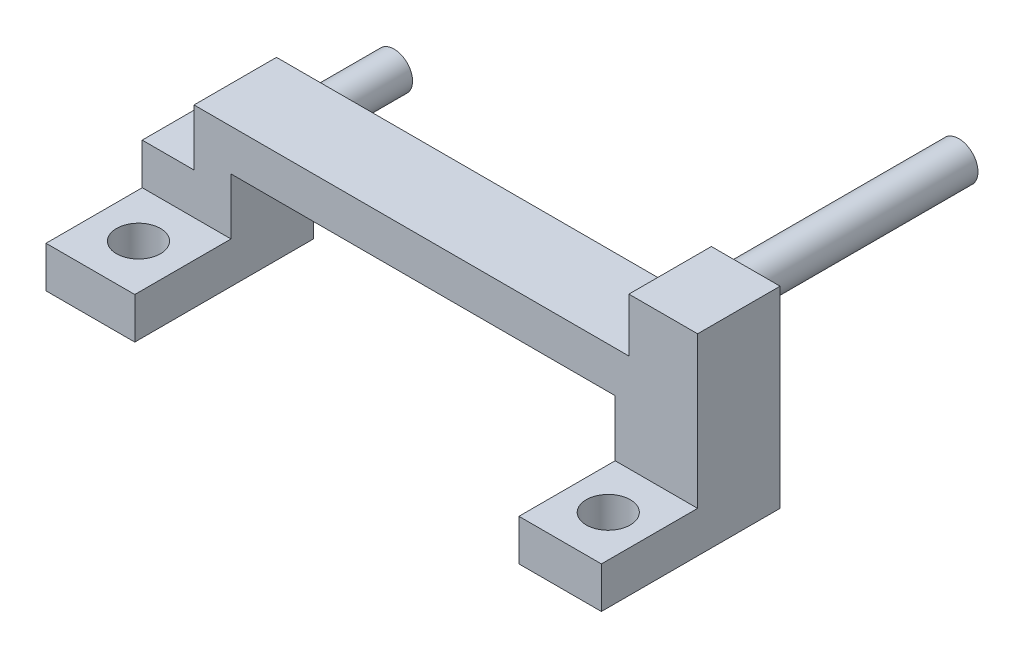
ISO-10303-21;
HEADER;
FILE_DESCRIPTION(('STEP AP214'),'2;1');
FILE_NAME('part.step','',(''),(''),'','','');
FILE_SCHEMA(('AUTOMOTIVE_DESIGN { 1 0 10303 214 1 1 1 1 }'));
ENDSEC;
DATA;
#1=APPLICATION_CONTEXT('core data for automotive mechanical design processes');
#2=APPLICATION_PROTOCOL_DEFINITION('international standard','automotive_design',2000,#1);
#3=PRODUCT_CONTEXT('',#1,'mechanical');
#4=PRODUCT('Part','Part','',(#3));
#5=PRODUCT_RELATED_PRODUCT_CATEGORY('part','',(#4));
#6=PRODUCT_DEFINITION_FORMATION('','',#4);
#7=PRODUCT_DEFINITION_CONTEXT('part definition',#1,'design');
#8=PRODUCT_DEFINITION('design','',#6,#7);
#9=PRODUCT_DEFINITION_SHAPE('','',#8);
#10=(LENGTH_UNIT() NAMED_UNIT(*) SI_UNIT(.MILLI.,.METRE.));
#11=(NAMED_UNIT(*) PLANE_ANGLE_UNIT() SI_UNIT($,.RADIAN.));
#12=(NAMED_UNIT(*) SI_UNIT($,.STERADIAN.) SOLID_ANGLE_UNIT());
#13=UNCERTAINTY_MEASURE_WITH_UNIT(LENGTH_MEASURE(1.E-05),#10,'distance_accuracy_value','');
#14=(GEOMETRIC_REPRESENTATION_CONTEXT(3) GLOBAL_UNCERTAINTY_ASSIGNED_CONTEXT((#13)) GLOBAL_UNIT_ASSIGNED_CONTEXT((#10,
#11,#12)) REPRESENTATION_CONTEXT('',''));
#15=CARTESIAN_POINT('',(0.,0.,0.));
#16=DIRECTION('',(0.,0.,1.));
#17=DIRECTION('',(1.,0.,0.));
#18=AXIS2_PLACEMENT_3D('',#15,#16,#17);
#19=CARTESIAN_POINT('',(0.,0.,6.));
#20=DIRECTION('',(0.,0.,-1.));
#21=DIRECTION('',(-1.,0.,0.));
#22=AXIS2_PLACEMENT_3D('',#19,#20,#21);
#23=PLANE('',#22);
#24=DIRECTION('',(0.,1.,0.));
#25=VECTOR('',#24,1.);
#26=CARTESIAN_POINT('',(-4.43414634146342,-3.49756097560976,6.));
#27=LINE('',#26,#25);
#28=CARTESIAN_POINT('',(-4.43414634146342,-7.59756097560976,6.));
#29=VERTEX_POINT('',#28);
#30=CARTESIAN_POINT('',(-4.43414634146342,-3.49756097560976,6.));
#31=VERTEX_POINT('',#30);
#32=EDGE_CURVE('E217',#29,#31,#27,.T.);
#33=ORIENTED_EDGE('',*,*,#32,.F.);
#34=DIRECTION('',(-1.,0.,0.));
#35=VECTOR('',#34,1.);
#36=CARTESIAN_POINT('',(-3.43414634146343,-7.59756097560976,6.));
#37=LINE('',#36,#35);
#38=CARTESIAN_POINT('',(1.56585365853658,-7.59756097560976,6.));
#39=VERTEX_POINT('',#38);
#40=EDGE_CURVE('E281',#39,#29,#37,.T.);
#41=ORIENTED_EDGE('',*,*,#40,.F.);
#42=DIRECTION('',(0.,-1.,0.));
#43=VECTOR('',#42,1.);
#44=CARTESIAN_POINT('',(1.56585365853658,-10.5975609756098,6.));
#45=LINE('',#44,#43);
#46=CARTESIAN_POINT('',(1.56585365853657,3.40243902439024,6.));
#47=VERTEX_POINT('',#46);
#48=EDGE_CURVE('E192',#47,#39,#45,.T.);
#49=ORIENTED_EDGE('',*,*,#48,.F.);
#50=DIRECTION('',(-1.,0.,0.));
#51=VECTOR('',#50,1.);
#52=CARTESIAN_POINT('',(-3.43414634146343,3.40243902439024,6.));
#53=LINE('',#52,#51);
#54=CARTESIAN_POINT('',(-3.43414634146343,3.40243902439024,6.));
#55=VERTEX_POINT('',#54);
#56=EDGE_CURVE('E294',#47,#55,#53,.T.);
#57=ORIENTED_EDGE('',*,*,#56,.T.);
#58=DIRECTION('',(0.,-1.,0.));
#59=VECTOR('',#58,1.);
#60=CARTESIAN_POINT('',(-3.43414634146343,-1.49756097560976,6.));
#61=LINE('',#60,#59);
#62=CARTESIAN_POINT('',(-3.43414634146343,-0.497560975609757,6.));
#63=VERTEX_POINT('',#62);
#64=EDGE_CURVE('E298',#55,#63,#61,.T.);
#65=ORIENTED_EDGE('',*,*,#64,.T.);
#66=DIRECTION('',(1.,0.,0.));
#67=VECTOR('',#66,1.);
#68=CARTESIAN_POINT('',(-35.0731395246062,-0.497560975609762,6.));
#69=LINE('',#68,#67);
#70=CARTESIAN_POINT('',(-35.0731395246062,-0.497560975609762,6.));
#71=VERTEX_POINT('',#70);
#72=EDGE_CURVE('E204',#71,#63,#69,.T.);
#73=ORIENTED_EDGE('',*,*,#72,.F.);
#74=DIRECTION('',(0.,-1.,0.));
#75=VECTOR('',#74,1.);
#76=CARTESIAN_POINT('',(-35.0731395246062,-4.59756097560976,6.));
#77=LINE('',#76,#75);
#78=CARTESIAN_POINT('',(-35.0731395246062,-4.59756097560976,6.));
#79=VERTEX_POINT('',#78);
#80=EDGE_CURVE('E302',#71,#79,#77,.T.);
#81=ORIENTED_EDGE('',*,*,#80,.T.);
#82=DIRECTION('',(-1.,0.,0.));
#83=VECTOR('',#82,1.);
#84=CARTESIAN_POINT('',(-38.8431395246063,-4.59756097560976,6.));
#85=LINE('',#84,#83);
#86=CARTESIAN_POINT('',(-38.8431395246063,-4.59756097560976,6.));
#87=VERTEX_POINT('',#86);
#88=EDGE_CURVE('E306',#79,#87,#85,.T.);
#89=ORIENTED_EDGE('',*,*,#88,.T.);
#90=DIRECTION('',(0.,-1.,0.));
#91=VECTOR('',#90,1.);
#92=CARTESIAN_POINT('',(-38.8431395246063,-10.5975609756098,6.));
#93=LINE('',#92,#91);
#94=CARTESIAN_POINT('',(-38.8431395246063,-7.59756097560976,6.));
#95=VERTEX_POINT('',#94);
#96=EDGE_CURVE('E68',#87,#95,#93,.T.);
#97=ORIENTED_EDGE('',*,*,#96,.T.);
#98=DIRECTION('',(-1.,0.,0.));
#99=VECTOR('',#98,1.);
#100=CARTESIAN_POINT('',(-32.3841463414634,-7.59756097560976,6.));
#101=LINE('',#100,#99);
#102=CARTESIAN_POINT('',(-32.3841463414634,-7.59756097560976,6.));
#103=VERTEX_POINT('',#102);
#104=EDGE_CURVE('E63',#103,#95,#101,.T.);
#105=ORIENTED_EDGE('',*,*,#104,.F.);
#106=DIRECTION('',(0.,1.,0.));
#107=VECTOR('',#106,1.);
#108=CARTESIAN_POINT('',(-32.3841463414634,-3.49756097560976,6.));
#109=LINE('',#108,#107);
#110=CARTESIAN_POINT('',(-32.3841463414634,-3.49756097560976,6.));
#111=VERTEX_POINT('',#110);
#112=EDGE_CURVE('E287',#103,#111,#109,.T.);
#113=ORIENTED_EDGE('',*,*,#112,.T.);
#114=DIRECTION('',(1.,0.,0.));
#115=VECTOR('',#114,1.);
#116=CARTESIAN_POINT('',(-3.43414634146343,-3.49756097560976,6.));
#117=LINE('',#116,#115);
#118=EDGE_CURVE('E290',#111,#31,#117,.T.);
#119=ORIENTED_EDGE('',*,*,#118,.T.);
#120=EDGE_LOOP('',(#33,#41,#49,#57,#65,#73,#81,#89,#97,#105,#113,#119));
#121=FACE_BOUND('',#120,.T.);
#122=ADVANCED_FACE('F47',(#121),#23,.F.);
#123=CARTESIAN_POINT('',(-34.3841463414634,-3.49756097560976,0.));
#124=DIRECTION('',(0.,1.,0.));
#125=DIRECTION('',(-1.,0.,0.));
#126=AXIS2_PLACEMENT_3D('',#123,#124,#125);
#127=PLANE('',#126);
#128=DIRECTION('',(1.,0.,0.));
#129=VECTOR('',#128,1.);
#130=CARTESIAN_POINT('',(-34.3841463414634,-3.49756097560976,0.));
#131=LINE('',#130,#129);
#132=CARTESIAN_POINT('',(-32.3841463414634,-3.49756097560976,0.));
#133=VERTEX_POINT('',#132);
#134=CARTESIAN_POINT('',(-4.43414634146342,-3.49756097560976,0.));
#135=VERTEX_POINT('',#134);
#136=EDGE_CURVE('E336',#133,#135,#131,.T.);
#137=ORIENTED_EDGE('',*,*,#136,.T.);
#138=DIRECTION('',(0.,0.,-1.));
#139=VECTOR('',#138,1.);
#140=CARTESIAN_POINT('',(-4.43414634146342,-3.49756097560976,0.));
#141=LINE('',#140,#139);
#142=EDGE_CURVE('E220',#31,#135,#141,.T.);
#143=ORIENTED_EDGE('',*,*,#142,.F.);
#144=ORIENTED_EDGE('',*,*,#118,.F.);
#145=DIRECTION('',(0.,0.,1.));
#146=VECTOR('',#145,1.);
#147=CARTESIAN_POINT('',(-32.3841463414634,-3.49756097560976,3.));
#148=LINE('',#147,#146);
#149=EDGE_CURVE('E354',#133,#111,#148,.T.);
#150=ORIENTED_EDGE('',*,*,#149,.F.);
#151=EDGE_LOOP('',(#137,#143,#144,#150));
#152=FACE_BOUND('',#151,.T.);
#153=ADVANCED_FACE('F49',(#152),#127,.F.);
#154=CARTESIAN_POINT('',(0.,0.,0.));
#155=DIRECTION('',(0.,0.,1.));
#156=DIRECTION('',(1.,0.,0.));
#157=AXIS2_PLACEMENT_3D('',#154,#155,#156);
#158=PLANE('',#157);
#159=CARTESIAN_POINT('',(-36.5231395246063,-7.04756097560976,0.));
#160=DIRECTION('',(0.,0.,1.));
#161=DIRECTION('',(1.,0.,0.));
#162=AXIS2_PLACEMENT_3D('',#159,#160,#161);
#163=CIRCLE('',#162,1.35);
#164=CARTESIAN_POINT('',(-35.1731395246063,-7.04756097560976,0.));
#165=VERTEX_POINT('',#164);
#166=EDGE_CURVE('E11',#165,#165,#163,.F.);
#167=ORIENTED_EDGE('',*,*,#166,.F.);
#168=EDGE_LOOP('',(#167));
#169=FACE_BOUND('',#168,.T.);
#170=CARTESIAN_POINT('',(-1.43414634146342,1.80243902439024,0.));
#171=DIRECTION('',(0.,0.,1.));
#172=DIRECTION('',(1.,0.,0.));
#173=AXIS2_PLACEMENT_3D('',#170,#171,#172);
#174=CIRCLE('',#173,1.4);
#175=CARTESIAN_POINT('',(-0.034146341463424,1.80243902439024,0.));
#176=VERTEX_POINT('',#175);
#177=EDGE_CURVE('E337',#176,#176,#174,.F.);
#178=ORIENTED_EDGE('',*,*,#177,.F.);
#179=EDGE_LOOP('',(#178));
#180=FACE_BOUND('',#179,.T.);
#181=DIRECTION('',(1.,0.,0.));
#182=VECTOR('',#181,1.);
#183=CARTESIAN_POINT('',(-35.3841463414634,-10.5975609756098,0.));
#184=LINE('',#183,#182);
#185=CARTESIAN_POINT('',(-38.8431395246063,-10.5975609756098,0.));
#186=VERTEX_POINT('',#185);
#187=CARTESIAN_POINT('',(-32.3841463414634,-10.5975609756098,0.));
#188=VERTEX_POINT('',#187);
#189=EDGE_CURVE('E361',#186,#188,#184,.T.);
#190=ORIENTED_EDGE('',*,*,#189,.F.);
#191=DIRECTION('',(0.,-1.,0.));
#192=VECTOR('',#191,1.);
#193=CARTESIAN_POINT('',(-38.8431395246063,-4.59756097560976,0.));
#194=LINE('',#193,#192);
#195=CARTESIAN_POINT('',(-38.8431395246063,-4.59756097560976,0.));
#196=VERTEX_POINT('',#195);
#197=EDGE_CURVE('E316',#196,#186,#194,.T.);
#198=ORIENTED_EDGE('',*,*,#197,.F.);
#199=DIRECTION('',(1.,0.,0.));
#200=VECTOR('',#199,1.);
#201=CARTESIAN_POINT('',(-38.8431395246063,-4.59756097560976,0.));
#202=LINE('',#201,#200);
#203=CARTESIAN_POINT('',(-35.0731395246062,-4.59756097560976,0.));
#204=VERTEX_POINT('',#203);
#205=EDGE_CURVE('E326',#196,#204,#202,.T.);
#206=ORIENTED_EDGE('',*,*,#205,.T.);
#207=DIRECTION('',(0.,-1.,0.));
#208=VECTOR('',#207,1.);
#209=CARTESIAN_POINT('',(-35.0731395246062,-1.49756097560976,0.));
#210=LINE('',#209,#208);
#211=CARTESIAN_POINT('',(-35.0731395246062,-0.497560975609762,0.));
#212=VERTEX_POINT('',#211);
#213=EDGE_CURVE('E333',#212,#204,#210,.T.);
#214=ORIENTED_EDGE('',*,*,#213,.F.);
#215=DIRECTION('',(-1.,0.,0.));
#216=VECTOR('',#215,1.);
#217=CARTESIAN_POINT('',(-35.0731395246062,-0.497560975609762,0.));
#218=LINE('',#217,#216);
#219=CARTESIAN_POINT('',(-3.43414634146343,-0.497560975609757,0.));
#220=VERTEX_POINT('',#219);
#221=EDGE_CURVE('E210',#220,#212,#218,.T.);
#222=ORIENTED_EDGE('',*,*,#221,.F.);
#223=DIRECTION('',(0.,-1.,0.));
#224=VECTOR('',#223,1.);
#225=CARTESIAN_POINT('',(-3.43414634146343,3.40243902439024,0.));
#226=LINE('',#225,#224);
#227=CARTESIAN_POINT('',(-3.43414634146343,3.40243902439024,0.));
#228=VERTEX_POINT('',#227);
#229=EDGE_CURVE('E173',#228,#220,#226,.T.);
#230=ORIENTED_EDGE('',*,*,#229,.F.);
#231=DIRECTION('',(-1.,0.,0.));
#232=VECTOR('',#231,1.);
#233=CARTESIAN_POINT('',(-3.43414634146343,3.40243902439024,0.));
#234=LINE('',#233,#232);
#235=CARTESIAN_POINT('',(1.56585365853657,3.40243902439024,0.));
#236=VERTEX_POINT('',#235);
#237=EDGE_CURVE('E172',#236,#228,#234,.T.);
#238=ORIENTED_EDGE('',*,*,#237,.F.);
#239=DIRECTION('',(0.,1.,0.));
#240=VECTOR('',#239,1.);
#241=CARTESIAN_POINT('',(1.56585365853658,-10.5975609756098,0.));
#242=LINE('',#241,#240);
#243=CARTESIAN_POINT('',(1.56585365853658,-10.5975609756098,0.));
#244=VERTEX_POINT('',#243);
#245=EDGE_CURVE('E180',#244,#236,#242,.T.);
#246=ORIENTED_EDGE('',*,*,#245,.F.);
#247=DIRECTION('',(1.,0.,0.));
#248=VECTOR('',#247,1.);
#249=CARTESIAN_POINT('',(-3.43414634146342,-10.5975609756098,0.));
#250=LINE('',#249,#248);
#251=CARTESIAN_POINT('',(-4.43414634146342,-10.5975609756098,0.));
#252=VERTEX_POINT('',#251);
#253=EDGE_CURVE('E160',#252,#244,#250,.T.);
#254=ORIENTED_EDGE('',*,*,#253,.F.);
#255=DIRECTION('',(0.,-1.,0.));
#256=VECTOR('',#255,1.);
#257=CARTESIAN_POINT('',(-4.43414634146342,-3.49756097560976,0.));
#258=LINE('',#257,#256);
#259=EDGE_CURVE('E214',#135,#252,#258,.T.);
#260=ORIENTED_EDGE('',*,*,#259,.F.);
#261=ORIENTED_EDGE('',*,*,#136,.F.);
#262=DIRECTION('',(0.,1.,0.));
#263=VECTOR('',#262,1.);
#264=CARTESIAN_POINT('',(-32.3841463414634,-10.5975609756098,0.));
#265=LINE('',#264,#263);
#266=EDGE_CURVE('E358',#188,#133,#265,.T.);
#267=ORIENTED_EDGE('',*,*,#266,.F.);
#268=EDGE_LOOP('',(#190,#198,#206,#214,#222,#230,#238,#246,#254,#260,#261,#267));
#269=FACE_BOUND('',#268,.T.);
#270=ADVANCED_FACE('F188',(#169,#180,#269),#158,.F.);
#271=CARTESIAN_POINT('',(-3.43414634146343,3.40243902439024,3.));
#272=DIRECTION('',(1.,0.,0.));
#273=DIRECTION('',(0.,1.,0.));
#274=AXIS2_PLACEMENT_3D('',#271,#272,#273);
#275=PLANE('',#274);
#276=ORIENTED_EDGE('',*,*,#229,.T.);
#277=DIRECTION('',(0.,0.,-1.));
#278=VECTOR('',#277,1.);
#279=CARTESIAN_POINT('',(-3.43414634146343,-0.497560975609757,0.));
#280=LINE('',#279,#278);
#281=EDGE_CURVE('E207',#63,#220,#280,.T.);
#282=ORIENTED_EDGE('',*,*,#281,.F.);
#283=ORIENTED_EDGE('',*,*,#64,.F.);
#284=DIRECTION('',(0.,0.,-1.));
#285=VECTOR('',#284,1.);
#286=CARTESIAN_POINT('',(-3.43414634146343,3.40243902439024,3.));
#287=LINE('',#286,#285);
#288=EDGE_CURVE('E342',#55,#228,#287,.T.);
#289=ORIENTED_EDGE('',*,*,#288,.T.);
#290=EDGE_LOOP('',(#276,#282,#283,#289));
#291=FACE_BOUND('',#290,.T.);
#292=ADVANCED_FACE('F401',(#291),#275,.F.);
#293=CARTESIAN_POINT('',(-3.43414634146342,-10.5975609756098,3.));
#294=DIRECTION('',(0.,1.,0.));
#295=DIRECTION('',(0.,0.,1.));
#296=AXIS2_PLACEMENT_3D('',#293,#294,#295);
#297=PLANE('',#296);
#298=ORIENTED_EDGE('',*,*,#253,.T.);
#299=DIRECTION('',(0.,0.,-1.));
#300=VECTOR('',#299,1.);
#301=CARTESIAN_POINT('',(1.56585365853658,-10.5975609756098,6.));
#302=LINE('',#301,#300);
#303=CARTESIAN_POINT('',(1.56585365853658,-10.5975609756098,13.));
#304=VERTEX_POINT('',#303);
#305=EDGE_CURVE('E164',#304,#244,#302,.T.);
#306=ORIENTED_EDGE('',*,*,#305,.F.);
#307=DIRECTION('',(1.,0.,0.));
#308=VECTOR('',#307,1.);
#309=CARTESIAN_POINT('',(-3.43414634146343,-10.5975609756098,13.));
#310=LINE('',#309,#308);
#311=CARTESIAN_POINT('',(-4.43414634146342,-10.5975609756098,13.));
#312=VERTEX_POINT('',#311);
#313=EDGE_CURVE('E284',#312,#304,#310,.T.);
#314=ORIENTED_EDGE('',*,*,#313,.F.);
#315=DIRECTION('',(0.,0.,1.));
#316=VECTOR('',#315,1.);
#317=CARTESIAN_POINT('',(-4.43414634146342,-10.5975609756098,6.));
#318=LINE('',#317,#316);
#319=EDGE_CURVE('E166',#252,#312,#318,.T.);
#320=ORIENTED_EDGE('',*,*,#319,.F.);
#321=EDGE_LOOP('',(#298,#306,#314,#320));
#322=FACE_BOUND('',#321,.T.);
#323=CARTESIAN_POINT('',(-1.43414634146343,-10.5975609756098,9.5));
#324=DIRECTION('',(0.,1.,0.));
#325=DIRECTION('',(0.,0.,1.));
#326=AXIS2_PLACEMENT_3D('',#323,#324,#325);
#327=CIRCLE('',#326,1.6);
#328=CARTESIAN_POINT('',(-1.43414634146343,-10.5975609756098,11.1));
#329=VERTEX_POINT('',#328);
#330=EDGE_CURVE('E241',#329,#329,#327,.T.);
#331=ORIENTED_EDGE('',*,*,#330,.T.);
#332=EDGE_LOOP('',(#331));
#333=FACE_BOUND('',#332,.T.);
#334=ADVANCED_FACE('F162',(#322,#333),#297,.F.);
#335=CARTESIAN_POINT('',(-3.43414634146343,3.40243902439024,3.));
#336=DIRECTION('',(0.,-1.,0.));
#337=DIRECTION('',(0.,0.,-1.));
#338=AXIS2_PLACEMENT_3D('',#335,#336,#337);
#339=PLANE('',#338);
#340=ORIENTED_EDGE('',*,*,#237,.T.);
#341=ORIENTED_EDGE('',*,*,#288,.F.);
#342=ORIENTED_EDGE('',*,*,#56,.F.);
#343=DIRECTION('',(0.,0.,1.));
#344=VECTOR('',#343,1.);
#345=CARTESIAN_POINT('',(1.56585365853657,3.40243902439024,6.));
#346=LINE('',#345,#344);
#347=EDGE_CURVE('E191',#236,#47,#346,.T.);
#348=ORIENTED_EDGE('',*,*,#347,.F.);
#349=EDGE_LOOP('',(#340,#341,#342,#348));
#350=FACE_BOUND('',#349,.T.);
#351=ADVANCED_FACE('F403',(#350),#339,.F.);
#352=CARTESIAN_POINT('',(-1.43414634146342,1.80243902439024,-16.));
#353=DIRECTION('',(0.,0.,1.));
#354=DIRECTION('',(1.,0.,0.));
#355=AXIS2_PLACEMENT_3D('',#352,#353,#354);
#356=CYLINDRICAL_SURFACE('',#355,1.4);
#357=CARTESIAN_POINT('',(-1.43414634146342,1.80243902439024,-16.));
#358=DIRECTION('',(0.,0.,-1.));
#359=DIRECTION('',(-1.,0.,0.));
#360=AXIS2_PLACEMENT_3D('',#357,#358,#359);
#361=CIRCLE('',#360,1.4);
#362=CARTESIAN_POINT('',(-2.83414634146342,1.80243902439024,-16.));
#363=VERTEX_POINT('',#362);
#364=EDGE_CURVE('E341',#363,#363,#361,.T.);
#365=ORIENTED_EDGE('',*,*,#364,.F.);
#366=EDGE_LOOP('',(#365));
#367=FACE_BOUND('',#366,.T.);
#368=ORIENTED_EDGE('',*,*,#177,.T.);
#369=EDGE_LOOP('',(#368));
#370=FACE_BOUND('',#369,.T.);
#371=ADVANCED_FACE('F462',(#367,#370),#356,.T.);
#372=CARTESIAN_POINT('',(-1.43414634146342,1.80243902439024,-16.));
#373=DIRECTION('',(0.,0.,-1.));
#374=DIRECTION('',(-1.,0.,0.));
#375=AXIS2_PLACEMENT_3D('',#372,#373,#374);
#376=PLANE('',#375);
#377=ORIENTED_EDGE('',*,*,#364,.T.);
#378=EDGE_LOOP('',(#377));
#379=FACE_BOUND('',#378,.T.);
#380=ADVANCED_FACE('F467',(#379),#376,.T.);
#381=CARTESIAN_POINT('',(-32.3841463414634,-10.5975609756098,3.));
#382=DIRECTION('',(-1.,0.,0.));
#383=DIRECTION('',(0.,-1.,0.));
#384=AXIS2_PLACEMENT_3D('',#381,#382,#383);
#385=PLANE('',#384);
#386=ORIENTED_EDGE('',*,*,#149,.T.);
#387=ORIENTED_EDGE('',*,*,#112,.F.);
#388=DIRECTION('',(0.,0.,-1.));
#389=VECTOR('',#388,1.);
#390=CARTESIAN_POINT('',(-32.3841463414634,-7.59756097560976,13.));
#391=LINE('',#390,#389);
#392=CARTESIAN_POINT('',(-32.3841463414634,-7.59756097560976,13.));
#393=VERTEX_POINT('',#392);
#394=EDGE_CURVE('E274',#393,#103,#391,.T.);
#395=ORIENTED_EDGE('',*,*,#394,.F.);
#396=DIRECTION('',(0.,1.,0.));
#397=VECTOR('',#396,1.);
#398=CARTESIAN_POINT('',(-32.3841463414634,-10.5975609756098,13.));
#399=LINE('',#398,#397);
#400=CARTESIAN_POINT('',(-32.3841463414634,-10.5975609756098,13.));
#401=VERTEX_POINT('',#400);
#402=EDGE_CURVE('E253',#401,#393,#399,.T.);
#403=ORIENTED_EDGE('',*,*,#402,.F.);
#404=DIRECTION('',(0.,0.,1.));
#405=VECTOR('',#404,1.);
#406=CARTESIAN_POINT('',(-32.3841463414634,-10.5975609756098,3.));
#407=LINE('',#406,#405);
#408=EDGE_CURVE('E56',#188,#401,#407,.T.);
#409=ORIENTED_EDGE('',*,*,#408,.F.);
#410=ORIENTED_EDGE('',*,*,#266,.T.);
#411=EDGE_LOOP('',(#386,#387,#395,#403,#409,#410));
#412=FACE_BOUND('',#411,.T.);
#413=ADVANCED_FACE('F378',(#412),#385,.F.);
#414=CARTESIAN_POINT('',(0.,-10.5975609756098,0.));
#415=DIRECTION('',(0.,-1.,0.));
#416=DIRECTION('',(0.,0.,-1.));
#417=AXIS2_PLACEMENT_3D('',#414,#415,#416);
#418=PLANE('',#417);
#419=CARTESIAN_POINT('',(-35.6136429330348,-10.5975609756098,9.5));
#420=DIRECTION('',(0.,-1.,0.));
#421=DIRECTION('',(0.,0.,-1.));
#422=AXIS2_PLACEMENT_3D('',#419,#420,#421);
#423=CIRCLE('',#422,1.6);
#424=CARTESIAN_POINT('',(-35.6136429330348,-10.5975609756098,7.9));
#425=VERTEX_POINT('',#424);
#426=EDGE_CURVE('E249',#425,#425,#423,.T.);
#427=ORIENTED_EDGE('',*,*,#426,.F.);
#428=EDGE_LOOP('',(#427));
#429=FACE_BOUND('',#428,.T.);
#430=ORIENTED_EDGE('',*,*,#408,.T.);
#431=DIRECTION('',(1.,0.,0.));
#432=VECTOR('',#431,1.);
#433=CARTESIAN_POINT('',(-32.3841463414634,-10.5975609756098,13.));
#434=LINE('',#433,#432);
#435=CARTESIAN_POINT('',(-38.8431395246063,-10.5975609756098,13.));
#436=VERTEX_POINT('',#435);
#437=EDGE_CURVE('E264',#436,#401,#434,.T.);
#438=ORIENTED_EDGE('',*,*,#437,.F.);
#439=DIRECTION('',(0.,0.,1.));
#440=VECTOR('',#439,1.);
#441=CARTESIAN_POINT('',(-38.8431395246063,-10.5975609756098,0.));
#442=LINE('',#441,#440);
#443=EDGE_CURVE('E320',#186,#436,#442,.T.);
#444=ORIENTED_EDGE('',*,*,#443,.F.);
#445=ORIENTED_EDGE('',*,*,#189,.T.);
#446=EDGE_LOOP('',(#430,#438,#444,#445));
#447=FACE_BOUND('',#446,.T.);
#448=ADVANCED_FACE('F370',(#429,#447),#418,.T.);
#449=CARTESIAN_POINT('',(-35.0731395246062,0.,0.));
#450=DIRECTION('',(-1.,0.,0.));
#451=DIRECTION('',(0.,0.,1.));
#452=AXIS2_PLACEMENT_3D('',#449,#450,#451);
#453=PLANE('',#452);
#454=DIRECTION('',(0.,0.,-1.));
#455=VECTOR('',#454,1.);
#456=CARTESIAN_POINT('',(-35.0731395246062,-4.59756097560976,0.));
#457=LINE('',#456,#455);
#458=EDGE_CURVE('E315',#79,#204,#457,.T.);
#459=ORIENTED_EDGE('',*,*,#458,.F.);
#460=ORIENTED_EDGE('',*,*,#80,.F.);
#461=DIRECTION('',(0.,0.,1.));
#462=VECTOR('',#461,1.);
#463=CARTESIAN_POINT('',(-35.0731395246062,-0.497560975609762,0.));
#464=LINE('',#463,#462);
#465=EDGE_CURVE('E196',#212,#71,#464,.T.);
#466=ORIENTED_EDGE('',*,*,#465,.F.);
#467=ORIENTED_EDGE('',*,*,#213,.T.);
#468=EDGE_LOOP('',(#459,#460,#466,#467));
#469=FACE_BOUND('',#468,.T.);
#470=ADVANCED_FACE('F392',(#469),#453,.T.);
#471=CARTESIAN_POINT('',(-38.8431395246063,-4.59756097560976,0.));
#472=DIRECTION('',(0.,-1.,0.));
#473=DIRECTION('',(0.,0.,-1.));
#474=AXIS2_PLACEMENT_3D('',#471,#472,#473);
#475=PLANE('',#474);
#476=ORIENTED_EDGE('',*,*,#458,.T.);
#477=ORIENTED_EDGE('',*,*,#205,.F.);
#478=DIRECTION('',(0.,0.,-1.));
#479=VECTOR('',#478,1.);
#480=CARTESIAN_POINT('',(-38.8431395246063,-4.59756097560976,0.));
#481=LINE('',#480,#479);
#482=EDGE_CURVE('E323',#87,#196,#481,.T.);
#483=ORIENTED_EDGE('',*,*,#482,.F.);
#484=ORIENTED_EDGE('',*,*,#88,.F.);
#485=EDGE_LOOP('',(#476,#477,#483,#484));
#486=FACE_BOUND('',#485,.T.);
#487=ADVANCED_FACE('F389',(#486),#475,.F.);
#488=CARTESIAN_POINT('',(-38.8431395246063,0.,0.));
#489=DIRECTION('',(-1.,0.,0.));
#490=DIRECTION('',(0.,0.,1.));
#491=AXIS2_PLACEMENT_3D('',#488,#489,#490);
#492=PLANE('',#491);
#493=ORIENTED_EDGE('',*,*,#197,.T.);
#494=ORIENTED_EDGE('',*,*,#443,.T.);
#495=DIRECTION('',(0.,-1.,0.));
#496=VECTOR('',#495,1.);
#497=CARTESIAN_POINT('',(-38.8431395246063,-10.5975609756098,13.));
#498=LINE('',#497,#496);
#499=CARTESIAN_POINT('',(-38.8431395246063,-7.59756097560976,13.));
#500=VERTEX_POINT('',#499);
#501=EDGE_CURVE('E260',#500,#436,#498,.T.);
#502=ORIENTED_EDGE('',*,*,#501,.F.);
#503=DIRECTION('',(0.,0.,-1.));
#504=VECTOR('',#503,1.);
#505=CARTESIAN_POINT('',(-38.8431395246063,-7.59756097560976,13.));
#506=LINE('',#505,#504);
#507=EDGE_CURVE('E268',#500,#95,#506,.T.);
#508=ORIENTED_EDGE('',*,*,#507,.T.);
#509=ORIENTED_EDGE('',*,*,#96,.F.);
#510=ORIENTED_EDGE('',*,*,#482,.T.);
#511=EDGE_LOOP('',(#493,#494,#502,#508,#509,#510));
#512=FACE_BOUND('',#511,.T.);
#513=ADVANCED_FACE('F385',(#512),#492,.T.);
#514=CARTESIAN_POINT('',(-36.5231395246063,-7.04756097560976,-10.));
#515=DIRECTION('',(0.,0.,1.));
#516=DIRECTION('',(1.,0.,0.));
#517=AXIS2_PLACEMENT_3D('',#514,#515,#516);
#518=CYLINDRICAL_SURFACE('',#517,1.35);
#519=CARTESIAN_POINT('',(-36.5231395246063,-7.04756097560976,-10.));
#520=DIRECTION('',(0.,0.,-1.));
#521=DIRECTION('',(-1.,0.,0.));
#522=AXIS2_PLACEMENT_3D('',#519,#520,#521);
#523=CIRCLE('',#522,1.35);
#524=CARTESIAN_POINT('',(-37.8731395246062,-7.04756097560976,-10.));
#525=VERTEX_POINT('',#524);
#526=EDGE_CURVE('E311',#525,#525,#523,.T.);
#527=ORIENTED_EDGE('',*,*,#526,.F.);
#528=EDGE_LOOP('',(#527));
#529=FACE_BOUND('',#528,.T.);
#530=ORIENTED_EDGE('',*,*,#166,.T.);
#531=EDGE_LOOP('',(#530));
#532=FACE_BOUND('',#531,.T.);
#533=ADVANCED_FACE('F445',(#529,#532),#518,.T.);
#534=CARTESIAN_POINT('',(-36.5231395246063,-7.04756097560976,-10.));
#535=DIRECTION('',(0.,0.,-1.));
#536=DIRECTION('',(-1.,0.,0.));
#537=AXIS2_PLACEMENT_3D('',#534,#535,#536);
#538=PLANE('',#537);
#539=ORIENTED_EDGE('',*,*,#526,.T.);
#540=EDGE_LOOP('',(#539));
#541=FACE_BOUND('',#540,.T.);
#542=ADVANCED_FACE('F442',(#541),#538,.T.);
#543=CARTESIAN_POINT('',(0.,0.,13.));
#544=DIRECTION('',(0.,0.,1.));
#545=DIRECTION('',(1.,0.,0.));
#546=AXIS2_PLACEMENT_3D('',#543,#544,#545);
#547=PLANE('',#546);
#548=DIRECTION('',(1.,0.,0.));
#549=VECTOR('',#548,1.);
#550=CARTESIAN_POINT('',(-3.43414634146343,-7.59756097560976,13.));
#551=LINE('',#550,#549);
#552=CARTESIAN_POINT('',(-4.43414634146342,-7.59756097560976,13.));
#553=VERTEX_POINT('',#552);
#554=CARTESIAN_POINT('',(1.56585365853658,-7.59756097560976,13.));
#555=VERTEX_POINT('',#554);
#556=EDGE_CURVE('E278',#553,#555,#551,.T.);
#557=ORIENTED_EDGE('',*,*,#556,.F.);
#558=DIRECTION('',(0.,1.,0.));
#559=VECTOR('',#558,1.);
#560=CARTESIAN_POINT('',(-4.43414634146342,-7.59756097560976,13.));
#561=LINE('',#560,#559);
#562=EDGE_CURVE('E225',#312,#553,#561,.T.);
#563=ORIENTED_EDGE('',*,*,#562,.F.);
#564=ORIENTED_EDGE('',*,*,#313,.T.);
#565=DIRECTION('',(0.,-1.,0.));
#566=VECTOR('',#565,1.);
#567=CARTESIAN_POINT('',(1.56585365853658,-7.59756097560976,13.));
#568=LINE('',#567,#566);
#569=EDGE_CURVE('E184',#555,#304,#568,.T.);
#570=ORIENTED_EDGE('',*,*,#569,.F.);
#571=EDGE_LOOP('',(#557,#563,#564,#570));
#572=FACE_BOUND('',#571,.T.);
#573=ADVANCED_FACE('F411',(#572),#547,.T.);
#574=CARTESIAN_POINT('',(0.,-7.59756097560976,0.));
#575=DIRECTION('',(0.,1.,0.));
#576=DIRECTION('',(0.,0.,1.));
#577=AXIS2_PLACEMENT_3D('',#574,#575,#576);
#578=PLANE('',#577);
#579=CARTESIAN_POINT('',(-1.43414634146343,-7.59756097560976,9.5));
#580=DIRECTION('',(0.,1.,0.));
#581=DIRECTION('',(0.,0.,1.));
#582=AXIS2_PLACEMENT_3D('',#579,#580,#581);
#583=CIRCLE('',#582,1.6);
#584=CARTESIAN_POINT('',(-1.43414634146343,-7.59756097560976,11.1));
#585=VERTEX_POINT('',#584);
#586=EDGE_CURVE('E186',#585,#585,#583,.T.);
#587=ORIENTED_EDGE('',*,*,#586,.F.);
#588=EDGE_LOOP('',(#587));
#589=FACE_BOUND('',#588,.T.);
#590=ORIENTED_EDGE('',*,*,#40,.T.);
#591=DIRECTION('',(0.,0.,-1.));
#592=VECTOR('',#591,1.);
#593=CARTESIAN_POINT('',(-4.43414634146342,-7.59756097560976,6.));
#594=LINE('',#593,#592);
#595=EDGE_CURVE('E229',#553,#29,#594,.T.);
#596=ORIENTED_EDGE('',*,*,#595,.F.);
#597=ORIENTED_EDGE('',*,*,#556,.T.);
#598=DIRECTION('',(0.,0.,1.));
#599=VECTOR('',#598,1.);
#600=CARTESIAN_POINT('',(1.56585365853658,-7.59756097560976,6.));
#601=LINE('',#600,#599);
#602=EDGE_CURVE('E233',#39,#555,#601,.T.);
#603=ORIENTED_EDGE('',*,*,#602,.F.);
#604=EDGE_LOOP('',(#590,#596,#597,#603));
#605=FACE_BOUND('',#604,.T.);
#606=ADVANCED_FACE('F407',(#589,#605),#578,.T.);
#607=CARTESIAN_POINT('',(-32.3841463414634,-7.59756097560976,13.));
#608=DIRECTION('',(0.,-1.,0.));
#609=DIRECTION('',(0.,0.,-1.));
#610=AXIS2_PLACEMENT_3D('',#607,#608,#609);
#611=PLANE('',#610);
#612=CARTESIAN_POINT('',(-35.6136429330348,-7.59756097560976,9.5));
#613=DIRECTION('',(0.,1.,0.));
#614=DIRECTION('',(0.,0.,1.));
#615=AXIS2_PLACEMENT_3D('',#612,#613,#614);
#616=CIRCLE('',#615,1.6);
#617=CARTESIAN_POINT('',(-35.6136429330348,-7.59756097560976,11.1));
#618=VERTEX_POINT('',#617);
#619=EDGE_CURVE('E245',#618,#618,#616,.T.);
#620=ORIENTED_EDGE('',*,*,#619,.F.);
#621=EDGE_LOOP('',(#620));
#622=FACE_BOUND('',#621,.T.);
#623=ORIENTED_EDGE('',*,*,#104,.T.);
#624=ORIENTED_EDGE('',*,*,#507,.F.);
#625=DIRECTION('',(-1.,0.,0.));
#626=VECTOR('',#625,1.);
#627=CARTESIAN_POINT('',(-32.3841463414634,-7.59756097560976,13.));
#628=LINE('',#627,#626);
#629=EDGE_CURVE('E257',#393,#500,#628,.T.);
#630=ORIENTED_EDGE('',*,*,#629,.F.);
#631=ORIENTED_EDGE('',*,*,#394,.T.);
#632=EDGE_LOOP('',(#623,#624,#630,#631));
#633=FACE_BOUND('',#632,.T.);
#634=ADVANCED_FACE('F418',(#622,#633),#611,.F.);
#635=CARTESIAN_POINT('',(0.,0.,13.));
#636=DIRECTION('',(0.,0.,1.));
#637=DIRECTION('',(1.,0.,0.));
#638=AXIS2_PLACEMENT_3D('',#635,#636,#637);
#639=PLANE('',#638);
#640=ORIENTED_EDGE('',*,*,#402,.T.);
#641=ORIENTED_EDGE('',*,*,#629,.T.);
#642=ORIENTED_EDGE('',*,*,#501,.T.);
#643=ORIENTED_EDGE('',*,*,#437,.T.);
#644=EDGE_LOOP('',(#640,#641,#642,#643));
#645=FACE_BOUND('',#644,.T.);
#646=ADVANCED_FACE('F381',(#645),#639,.T.);
#647=CARTESIAN_POINT('',(-35.6136429330348,-14.5975609756098,9.5));
#648=DIRECTION('',(0.,1.,0.));
#649=DIRECTION('',(0.,0.,1.));
#650=AXIS2_PLACEMENT_3D('',#647,#648,#649);
#651=CYLINDRICAL_SURFACE('',#650,1.6);
#652=ORIENTED_EDGE('',*,*,#426,.T.);
#653=EDGE_LOOP('',(#652));
#654=FACE_BOUND('',#653,.T.);
#655=ORIENTED_EDGE('',*,*,#619,.T.);
#656=EDGE_LOOP('',(#655));
#657=FACE_BOUND('',#656,.T.);
#658=ADVANCED_FACE('F427',(#654,#657),#651,.F.);
#659=CARTESIAN_POINT('',(-1.43414634146343,-14.5975609756098,9.5));
#660=DIRECTION('',(0.,1.,0.));
#661=DIRECTION('',(0.,0.,1.));
#662=AXIS2_PLACEMENT_3D('',#659,#660,#661);
#663=CYLINDRICAL_SURFACE('',#662,1.6);
#664=ORIENTED_EDGE('',*,*,#586,.T.);
#665=EDGE_LOOP('',(#664));
#666=FACE_BOUND('',#665,.T.);
#667=ORIENTED_EDGE('',*,*,#330,.F.);
#668=EDGE_LOOP('',(#667));
#669=FACE_BOUND('',#668,.T.);
#670=ADVANCED_FACE('F479',(#666,#669),#663,.F.);
#671=CARTESIAN_POINT('',(1.56585365853658,0.,0.));
#672=DIRECTION('',(-1.,0.,0.));
#673=DIRECTION('',(0.,-1.,0.));
#674=AXIS2_PLACEMENT_3D('',#671,#672,#673);
#675=PLANE('',#674);
#676=ORIENTED_EDGE('',*,*,#305,.T.);
#677=ORIENTED_EDGE('',*,*,#245,.T.);
#678=ORIENTED_EDGE('',*,*,#347,.T.);
#679=ORIENTED_EDGE('',*,*,#48,.T.);
#680=ORIENTED_EDGE('',*,*,#602,.T.);
#681=ORIENTED_EDGE('',*,*,#569,.T.);
#682=EDGE_LOOP('',(#676,#677,#678,#679,#680,#681));
#683=FACE_BOUND('',#682,.T.);
#684=ADVANCED_FACE('F178',(#683),#675,.F.);
#685=CARTESIAN_POINT('',(-4.43414634146342,0.,0.));
#686=DIRECTION('',(-1.,0.,0.));
#687=DIRECTION('',(0.,-1.,0.));
#688=AXIS2_PLACEMENT_3D('',#685,#686,#687);
#689=PLANE('',#688);
#690=ORIENTED_EDGE('',*,*,#595,.T.);
#691=ORIENTED_EDGE('',*,*,#32,.T.);
#692=ORIENTED_EDGE('',*,*,#142,.T.);
#693=ORIENTED_EDGE('',*,*,#259,.T.);
#694=ORIENTED_EDGE('',*,*,#319,.T.);
#695=ORIENTED_EDGE('',*,*,#562,.T.);
#696=EDGE_LOOP('',(#690,#691,#692,#693,#694,#695));
#697=FACE_BOUND('',#696,.T.);
#698=ADVANCED_FACE('F413',(#697),#689,.T.);
#699=CARTESIAN_POINT('',(0.,-0.497560975609757,0.));
#700=DIRECTION('',(0.,1.,0.));
#701=DIRECTION('',(-1.,0.,0.));
#702=AXIS2_PLACEMENT_3D('',#699,#700,#701);
#703=PLANE('',#702);
#704=ORIENTED_EDGE('',*,*,#465,.T.);
#705=ORIENTED_EDGE('',*,*,#72,.T.);
#706=ORIENTED_EDGE('',*,*,#281,.T.);
#707=ORIENTED_EDGE('',*,*,#221,.T.);
#708=EDGE_LOOP('',(#704,#705,#706,#707));
#709=FACE_BOUND('',#708,.T.);
#710=ADVANCED_FACE('F399',(#709),#703,.T.);
#711=CLOSED_SHELL('',(#122,#153,#270,#292,#334,#351,#371,#380,#413,#448,#470,#487,#513,#533,
#542,#573,#606,#634,#646,#658,#670,#684,#698,#710));
#712=MANIFOLD_SOLID_BREP('B2',#711);
#713=ADVANCED_BREP_SHAPE_REPRESENTATION('',(#18,#712),#14);
#714=SHAPE_DEFINITION_REPRESENTATION(#9,#713);
ENDSEC;
END-ISO-10303-21;
